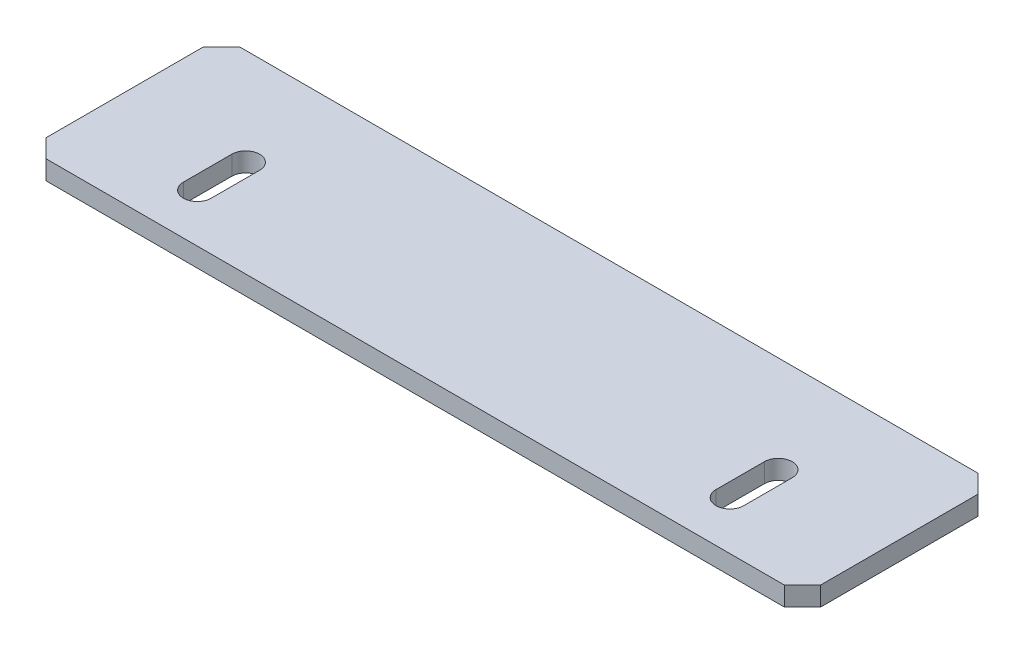
ISO-10303-21;
HEADER;
FILE_DESCRIPTION(('STEP AP214'),'2;1');
FILE_NAME('part.step','',(''),(''),'','','');
FILE_SCHEMA(('AUTOMOTIVE_DESIGN { 1 0 10303 214 1 1 1 1 }'));
ENDSEC;
DATA;
#1=APPLICATION_CONTEXT('core data for automotive mechanical design processes');
#2=APPLICATION_PROTOCOL_DEFINITION('international standard','automotive_design',2000,#1);
#3=PRODUCT_CONTEXT('',#1,'mechanical');
#4=PRODUCT('Part','Part','',(#3));
#5=PRODUCT_RELATED_PRODUCT_CATEGORY('part','',(#4));
#6=PRODUCT_DEFINITION_FORMATION('','',#4);
#7=PRODUCT_DEFINITION_CONTEXT('part definition',#1,'design');
#8=PRODUCT_DEFINITION('design','',#6,#7);
#9=PRODUCT_DEFINITION_SHAPE('','',#8);
#10=(LENGTH_UNIT() NAMED_UNIT(*) SI_UNIT(.MILLI.,.METRE.));
#11=(NAMED_UNIT(*) PLANE_ANGLE_UNIT() SI_UNIT($,.RADIAN.));
#12=(NAMED_UNIT(*) SI_UNIT($,.STERADIAN.) SOLID_ANGLE_UNIT());
#13=UNCERTAINTY_MEASURE_WITH_UNIT(LENGTH_MEASURE(1.E-05),#10,'distance_accuracy_value','');
#14=(GEOMETRIC_REPRESENTATION_CONTEXT(3) GLOBAL_UNCERTAINTY_ASSIGNED_CONTEXT((#13)) GLOBAL_UNIT_ASSIGNED_CONTEXT((#10,
#11,#12)) REPRESENTATION_CONTEXT('',''));
#15=CARTESIAN_POINT('',(0.,0.,0.));
#16=DIRECTION('',(0.,0.,1.));
#17=DIRECTION('',(1.,0.,0.));
#18=AXIS2_PLACEMENT_3D('',#15,#16,#17);
#19=CARTESIAN_POINT('',(0.,7.9,0.));
#20=DIRECTION('',(0.,-1.,0.));
#21=DIRECTION('',(0.,0.,-1.));
#22=AXIS2_PLACEMENT_3D('',#19,#20,#21);
#23=PLANE('',#22);
#24=CARTESIAN_POINT('',(220.,7.9,40.));
#25=DIRECTION('',(0.,1.,0.));
#26=DIRECTION('',(0.,0.,1.));
#27=AXIS2_PLACEMENT_3D('',#24,#25,#26);
#28=CIRCLE('',#27,11.5);
#29=CARTESIAN_POINT('',(208.5,7.9,40.));
#30=VERTEX_POINT('',#29);
#31=CARTESIAN_POINT('',(231.5,7.9,40.));
#32=VERTEX_POINT('',#31);
#33=EDGE_CURVE('E186',#30,#32,#28,.T.);
#34=ORIENTED_EDGE('',*,*,#33,.F.);
#35=DIRECTION('',(0.,0.,1.));
#36=VECTOR('',#35,1.);
#37=CARTESIAN_POINT('',(208.5,7.9,40.));
#38=LINE('',#37,#36);
#39=CARTESIAN_POINT('',(208.5,7.9,0.));
#40=VERTEX_POINT('',#39);
#41=EDGE_CURVE('E194',#40,#30,#38,.T.);
#42=ORIENTED_EDGE('',*,*,#41,.F.);
#43=CARTESIAN_POINT('',(220.,7.9,0.));
#44=DIRECTION('',(0.,1.,0.));
#45=DIRECTION('',(0.,0.,1.));
#46=AXIS2_PLACEMENT_3D('',#43,#44,#45);
#47=CIRCLE('',#46,11.5);
#48=CARTESIAN_POINT('',(231.5,7.9,0.));
#49=VERTEX_POINT('',#48);
#50=EDGE_CURVE('E191',#49,#40,#47,.T.);
#51=ORIENTED_EDGE('',*,*,#50,.F.);
#52=DIRECTION('',(0.,0.,-1.));
#53=VECTOR('',#52,1.);
#54=CARTESIAN_POINT('',(231.5,7.9,40.));
#55=LINE('',#54,#53);
#56=EDGE_CURVE('E188',#32,#49,#55,.T.);
#57=ORIENTED_EDGE('',*,*,#56,.F.);
#58=EDGE_LOOP('',(#34,#42,#51,#57));
#59=FACE_BOUND('',#58,.T.);
#60=DIRECTION('',(-1.,0.,0.));
#61=VECTOR('',#60,1.);
#62=CARTESIAN_POINT('',(-305.,7.9,-80.));
#63=LINE('',#62,#61);
#64=CARTESIAN_POINT('',(305.,7.9,-80.));
#65=VERTEX_POINT('',#64);
#66=CARTESIAN_POINT('',(-305.,7.9,-80.));
#67=VERTEX_POINT('',#66);
#68=EDGE_CURVE('E217',#65,#67,#63,.T.);
#69=ORIENTED_EDGE('',*,*,#68,.T.);
#70=DIRECTION('',(-0.707106781186548,0.,0.707106781186548));
#71=VECTOR('',#70,1.);
#72=CARTESIAN_POINT('',(-320.,7.9,-65.));
#73=LINE('',#72,#71);
#74=CARTESIAN_POINT('',(-320.,7.9,-65.));
#75=VERTEX_POINT('',#74);
#76=EDGE_CURVE('E220',#67,#75,#73,.T.);
#77=ORIENTED_EDGE('',*,*,#76,.T.);
#78=DIRECTION('',(0.,0.,1.));
#79=VECTOR('',#78,1.);
#80=CARTESIAN_POINT('',(-320.,7.9,-65.));
#81=LINE('',#80,#79);
#82=CARTESIAN_POINT('',(-320.,7.9,64.9999999999999));
#83=VERTEX_POINT('',#82);
#84=EDGE_CURVE('E223',#75,#83,#81,.T.);
#85=ORIENTED_EDGE('',*,*,#84,.T.);
#86=DIRECTION('',(0.707106781186546,0.,0.707106781186549));
#87=VECTOR('',#86,1.);
#88=CARTESIAN_POINT('',(-320.,7.9,64.9999999999999));
#89=LINE('',#88,#87);
#90=CARTESIAN_POINT('',(-305.,7.9,80.));
#91=VERTEX_POINT('',#90);
#92=EDGE_CURVE('E225',#83,#91,#89,.T.);
#93=ORIENTED_EDGE('',*,*,#92,.T.);
#94=DIRECTION('',(1.,0.,0.));
#95=VECTOR('',#94,1.);
#96=CARTESIAN_POINT('',(-305.,7.9,80.));
#97=LINE('',#96,#95);
#98=CARTESIAN_POINT('',(305.,7.9,80.));
#99=VERTEX_POINT('',#98);
#100=EDGE_CURVE('E227',#91,#99,#97,.T.);
#101=ORIENTED_EDGE('',*,*,#100,.T.);
#102=DIRECTION('',(0.707106781186548,0.,-0.707106781186548));
#103=VECTOR('',#102,1.);
#104=CARTESIAN_POINT('',(305.,7.9,80.));
#105=LINE('',#104,#103);
#106=CARTESIAN_POINT('',(320.,7.9,65.));
#107=VERTEX_POINT('',#106);
#108=EDGE_CURVE('E229',#99,#107,#105,.T.);
#109=ORIENTED_EDGE('',*,*,#108,.T.);
#110=DIRECTION('',(0.,0.,-1.));
#111=VECTOR('',#110,1.);
#112=CARTESIAN_POINT('',(320.,7.9,-65.0000000000001));
#113=LINE('',#112,#111);
#114=CARTESIAN_POINT('',(320.,7.9,-65.0000000000001));
#115=VERTEX_POINT('',#114);
#116=EDGE_CURVE('E231',#107,#115,#113,.T.);
#117=ORIENTED_EDGE('',*,*,#116,.T.);
#118=DIRECTION('',(-0.707106781186548,0.,-0.707106781186547));
#119=VECTOR('',#118,1.);
#120=CARTESIAN_POINT('',(305.,7.9,-80.));
#121=LINE('',#120,#119);
#122=EDGE_CURVE('E233',#115,#65,#121,.T.);
#123=ORIENTED_EDGE('',*,*,#122,.T.);
#124=EDGE_LOOP('',(#69,#77,#85,#93,#101,#109,#117,#123));
#125=FACE_BOUND('',#124,.T.);
#126=CARTESIAN_POINT('',(-220.,7.9,40.));
#127=DIRECTION('',(0.,1.,0.));
#128=DIRECTION('',(0.,0.,-1.));
#129=AXIS2_PLACEMENT_3D('',#126,#127,#128);
#130=CIRCLE('',#129,11.5);
#131=CARTESIAN_POINT('',(-231.5,7.9,40.));
#132=VERTEX_POINT('',#131);
#133=CARTESIAN_POINT('',(-208.5,7.9,40.));
#134=VERTEX_POINT('',#133);
#135=EDGE_CURVE('E150',#132,#134,#130,.T.);
#136=ORIENTED_EDGE('',*,*,#135,.F.);
#137=DIRECTION('',(0.,0.,1.));
#138=VECTOR('',#137,1.);
#139=CARTESIAN_POINT('',(-231.5,7.9,40.));
#140=LINE('',#139,#138);
#141=CARTESIAN_POINT('',(-231.5,7.9,0.));
#142=VERTEX_POINT('',#141);
#143=EDGE_CURVE('E172',#142,#132,#140,.T.);
#144=ORIENTED_EDGE('',*,*,#143,.F.);
#145=CARTESIAN_POINT('',(-220.,7.9,0.));
#146=DIRECTION('',(0.,1.,0.));
#147=DIRECTION('',(0.,0.,-1.));
#148=AXIS2_PLACEMENT_3D('',#145,#146,#147);
#149=CIRCLE('',#148,11.5);
#150=CARTESIAN_POINT('',(-208.5,7.9,0.));
#151=VERTEX_POINT('',#150);
#152=EDGE_CURVE('E170',#151,#142,#149,.T.);
#153=ORIENTED_EDGE('',*,*,#152,.F.);
#154=DIRECTION('',(0.,0.,-1.));
#155=VECTOR('',#154,1.);
#156=CARTESIAN_POINT('',(-208.5,7.9,40.));
#157=LINE('',#156,#155);
#158=EDGE_CURVE('E158',#134,#151,#157,.T.);
#159=ORIENTED_EDGE('',*,*,#158,.F.);
#160=EDGE_LOOP('',(#136,#144,#153,#159));
#161=FACE_BOUND('',#160,.T.);
#162=ADVANCED_FACE('F37',(#59,#125,#161),#23,.F.);
#163=CARTESIAN_POINT('',(0.,-7.9,0.));
#164=DIRECTION('',(0.,-1.,0.));
#165=DIRECTION('',(0.,0.,-1.));
#166=AXIS2_PLACEMENT_3D('',#163,#164,#165);
#167=PLANE('',#166);
#168=DIRECTION('',(-1.,0.,0.));
#169=VECTOR('',#168,1.);
#170=CARTESIAN_POINT('',(-305.,-7.9,-80.));
#171=LINE('',#170,#169);
#172=CARTESIAN_POINT('',(305.,-7.9,-80.));
#173=VERTEX_POINT('',#172);
#174=CARTESIAN_POINT('',(-305.,-7.9,-80.));
#175=VERTEX_POINT('',#174);
#176=EDGE_CURVE('E216',#173,#175,#171,.T.);
#177=ORIENTED_EDGE('',*,*,#176,.F.);
#178=DIRECTION('',(-0.707106781186548,0.,-0.707106781186547));
#179=VECTOR('',#178,1.);
#180=CARTESIAN_POINT('',(305.,-7.9,-80.));
#181=LINE('',#180,#179);
#182=CARTESIAN_POINT('',(320.,-7.9,-65.0000000000001));
#183=VERTEX_POINT('',#182);
#184=EDGE_CURVE('E221',#183,#173,#181,.T.);
#185=ORIENTED_EDGE('',*,*,#184,.F.);
#186=DIRECTION('',(0.,0.,-1.));
#187=VECTOR('',#186,1.);
#188=CARTESIAN_POINT('',(320.,-7.9,-65.0000000000001));
#189=LINE('',#188,#187);
#190=CARTESIAN_POINT('',(320.,-7.9,65.));
#191=VERTEX_POINT('',#190);
#192=EDGE_CURVE('E248',#191,#183,#189,.T.);
#193=ORIENTED_EDGE('',*,*,#192,.F.);
#194=DIRECTION('',(0.707106781186548,0.,-0.707106781186548));
#195=VECTOR('',#194,1.);
#196=CARTESIAN_POINT('',(305.,-7.9,80.));
#197=LINE('',#196,#195);
#198=CARTESIAN_POINT('',(305.,-7.9,80.));
#199=VERTEX_POINT('',#198);
#200=EDGE_CURVE('E246',#199,#191,#197,.T.);
#201=ORIENTED_EDGE('',*,*,#200,.F.);
#202=DIRECTION('',(1.,0.,0.));
#203=VECTOR('',#202,1.);
#204=CARTESIAN_POINT('',(-305.,-7.9,80.));
#205=LINE('',#204,#203);
#206=CARTESIAN_POINT('',(-305.,-7.9,80.));
#207=VERTEX_POINT('',#206);
#208=EDGE_CURVE('E244',#207,#199,#205,.T.);
#209=ORIENTED_EDGE('',*,*,#208,.F.);
#210=DIRECTION('',(0.707106781186546,0.,0.707106781186549));
#211=VECTOR('',#210,1.);
#212=CARTESIAN_POINT('',(-320.,-7.9,64.9999999999999));
#213=LINE('',#212,#211);
#214=CARTESIAN_POINT('',(-320.,-7.9,64.9999999999999));
#215=VERTEX_POINT('',#214);
#216=EDGE_CURVE('E242',#215,#207,#213,.T.);
#217=ORIENTED_EDGE('',*,*,#216,.F.);
#218=DIRECTION('',(0.,0.,1.));
#219=VECTOR('',#218,1.);
#220=CARTESIAN_POINT('',(-320.,-7.9,-65.));
#221=LINE('',#220,#219);
#222=CARTESIAN_POINT('',(-320.,-7.9,-65.));
#223=VERTEX_POINT('',#222);
#224=EDGE_CURVE('E240',#223,#215,#221,.T.);
#225=ORIENTED_EDGE('',*,*,#224,.F.);
#226=DIRECTION('',(-0.707106781186548,0.,0.707106781186548));
#227=VECTOR('',#226,1.);
#228=CARTESIAN_POINT('',(-320.,-7.9,-65.));
#229=LINE('',#228,#227);
#230=EDGE_CURVE('E238',#175,#223,#229,.T.);
#231=ORIENTED_EDGE('',*,*,#230,.F.);
#232=EDGE_LOOP('',(#177,#185,#193,#201,#209,#217,#225,#231));
#233=FACE_BOUND('',#232,.T.);
#234=DIRECTION('',(0.,0.,1.));
#235=VECTOR('',#234,1.);
#236=CARTESIAN_POINT('',(208.5,-7.9,40.));
#237=LINE('',#236,#235);
#238=CARTESIAN_POINT('',(208.5,-7.9,0.));
#239=VERTEX_POINT('',#238);
#240=CARTESIAN_POINT('',(208.5,-7.9,40.));
#241=VERTEX_POINT('',#240);
#242=EDGE_CURVE('E189',#239,#241,#237,.T.);
#243=ORIENTED_EDGE('',*,*,#242,.T.);
#244=CARTESIAN_POINT('',(220.,-7.9,40.));
#245=DIRECTION('',(0.,1.,0.));
#246=DIRECTION('',(0.,0.,1.));
#247=AXIS2_PLACEMENT_3D('',#244,#245,#246);
#248=CIRCLE('',#247,11.5);
#249=CARTESIAN_POINT('',(231.5,-7.9,40.));
#250=VERTEX_POINT('',#249);
#251=EDGE_CURVE('E166',#241,#250,#248,.T.);
#252=ORIENTED_EDGE('',*,*,#251,.T.);
#253=DIRECTION('',(0.,0.,-1.));
#254=VECTOR('',#253,1.);
#255=CARTESIAN_POINT('',(231.5,-7.9,40.));
#256=LINE('',#255,#254);
#257=CARTESIAN_POINT('',(231.5,-7.9,0.));
#258=VERTEX_POINT('',#257);
#259=EDGE_CURVE('E199',#250,#258,#256,.T.);
#260=ORIENTED_EDGE('',*,*,#259,.T.);
#261=CARTESIAN_POINT('',(220.,-7.9,0.));
#262=DIRECTION('',(0.,1.,0.));
#263=DIRECTION('',(0.,0.,1.));
#264=AXIS2_PLACEMENT_3D('',#261,#262,#263);
#265=CIRCLE('',#264,11.5);
#266=EDGE_CURVE('E202',#258,#239,#265,.T.);
#267=ORIENTED_EDGE('',*,*,#266,.T.);
#268=EDGE_LOOP('',(#243,#252,#260,#267));
#269=FACE_BOUND('',#268,.T.);
#270=DIRECTION('',(0.,0.,1.));
#271=VECTOR('',#270,1.);
#272=CARTESIAN_POINT('',(-231.5,-7.9,40.));
#273=LINE('',#272,#271);
#274=CARTESIAN_POINT('',(-231.5,-7.9,0.));
#275=VERTEX_POINT('',#274);
#276=CARTESIAN_POINT('',(-231.5,-7.9,40.));
#277=VERTEX_POINT('',#276);
#278=EDGE_CURVE('E159',#275,#277,#273,.T.);
#279=ORIENTED_EDGE('',*,*,#278,.T.);
#280=CARTESIAN_POINT('',(-220.,-7.9,40.));
#281=DIRECTION('',(0.,1.,0.));
#282=DIRECTION('',(0.,0.,-1.));
#283=AXIS2_PLACEMENT_3D('',#280,#281,#282);
#284=CIRCLE('',#283,11.5);
#285=CARTESIAN_POINT('',(-208.5,-7.9,40.));
#286=VERTEX_POINT('',#285);
#287=EDGE_CURVE('E60',#277,#286,#284,.T.);
#288=ORIENTED_EDGE('',*,*,#287,.T.);
#289=DIRECTION('',(0.,0.,-1.));
#290=VECTOR('',#289,1.);
#291=CARTESIAN_POINT('',(-208.5,-7.9,40.));
#292=LINE('',#291,#290);
#293=CARTESIAN_POINT('',(-208.5,-7.9,0.));
#294=VERTEX_POINT('',#293);
#295=EDGE_CURVE('E165',#286,#294,#292,.T.);
#296=ORIENTED_EDGE('',*,*,#295,.T.);
#297=CARTESIAN_POINT('',(-220.,-7.9,0.));
#298=DIRECTION('',(0.,1.,0.));
#299=DIRECTION('',(0.,0.,-1.));
#300=AXIS2_PLACEMENT_3D('',#297,#298,#299);
#301=CIRCLE('',#300,11.5);
#302=EDGE_CURVE('E178',#294,#275,#301,.T.);
#303=ORIENTED_EDGE('',*,*,#302,.T.);
#304=EDGE_LOOP('',(#279,#288,#296,#303));
#305=FACE_BOUND('',#304,.T.);
#306=ADVANCED_FACE('F278',(#233,#269,#305),#167,.T.);
#307=CARTESIAN_POINT('',(-305.,7.9,-80.));
#308=DIRECTION('',(0.,0.,1.));
#309=DIRECTION('',(1.,0.,0.));
#310=AXIS2_PLACEMENT_3D('',#307,#308,#309);
#311=PLANE('',#310);
#312=ORIENTED_EDGE('',*,*,#176,.T.);
#313=DIRECTION('',(0.,-1.,0.));
#314=VECTOR('',#313,1.);
#315=CARTESIAN_POINT('',(-305.,7.9,-80.));
#316=LINE('',#315,#314);
#317=EDGE_CURVE('E11',#67,#175,#316,.T.);
#318=ORIENTED_EDGE('',*,*,#317,.F.);
#319=ORIENTED_EDGE('',*,*,#68,.F.);
#320=DIRECTION('',(0.,-1.,0.));
#321=VECTOR('',#320,1.);
#322=CARTESIAN_POINT('',(305.,7.9,-80.));
#323=LINE('',#322,#321);
#324=EDGE_CURVE('E235',#65,#173,#323,.T.);
#325=ORIENTED_EDGE('',*,*,#324,.T.);
#326=EDGE_LOOP('',(#312,#318,#319,#325));
#327=FACE_BOUND('',#326,.T.);
#328=ADVANCED_FACE('F39',(#327),#311,.F.);
#329=CARTESIAN_POINT('',(-320.,7.9,-65.));
#330=DIRECTION('',(0.707106781186548,0.,0.707106781186548));
#331=DIRECTION('',(0.707106781186548,0.,-0.707106781186548));
#332=AXIS2_PLACEMENT_3D('',#329,#330,#331);
#333=PLANE('',#332);
#334=ORIENTED_EDGE('',*,*,#230,.T.);
#335=DIRECTION('',(0.,-1.,0.));
#336=VECTOR('',#335,1.);
#337=CARTESIAN_POINT('',(-320.,7.9,-65.));
#338=LINE('',#337,#336);
#339=EDGE_CURVE('E45',#75,#223,#338,.T.);
#340=ORIENTED_EDGE('',*,*,#339,.F.);
#341=ORIENTED_EDGE('',*,*,#76,.F.);
#342=ORIENTED_EDGE('',*,*,#317,.T.);
#343=EDGE_LOOP('',(#334,#340,#341,#342));
#344=FACE_BOUND('',#343,.T.);
#345=ADVANCED_FACE('F295',(#344),#333,.F.);
#346=CARTESIAN_POINT('',(-320.,7.9,-65.));
#347=DIRECTION('',(1.,0.,0.));
#348=DIRECTION('',(0.,0.,-1.));
#349=AXIS2_PLACEMENT_3D('',#346,#347,#348);
#350=PLANE('',#349);
#351=ORIENTED_EDGE('',*,*,#224,.T.);
#352=DIRECTION('',(0.,-1.,0.));
#353=VECTOR('',#352,1.);
#354=CARTESIAN_POINT('',(-320.,7.9,64.9999999999999));
#355=LINE('',#354,#353);
#356=EDGE_CURVE('E265',#83,#215,#355,.T.);
#357=ORIENTED_EDGE('',*,*,#356,.F.);
#358=ORIENTED_EDGE('',*,*,#84,.F.);
#359=ORIENTED_EDGE('',*,*,#339,.T.);
#360=EDGE_LOOP('',(#351,#357,#358,#359));
#361=FACE_BOUND('',#360,.T.);
#362=ADVANCED_FACE('F272',(#361),#350,.F.);
#363=CARTESIAN_POINT('',(-320.,7.9,64.9999999999999));
#364=DIRECTION('',(0.707106781186549,0.,-0.707106781186546));
#365=DIRECTION('',(-0.707106781186546,0.,-0.707106781186549));
#366=AXIS2_PLACEMENT_3D('',#363,#364,#365);
#367=PLANE('',#366);
#368=ORIENTED_EDGE('',*,*,#216,.T.);
#369=DIRECTION('',(0.,-1.,0.));
#370=VECTOR('',#369,1.);
#371=CARTESIAN_POINT('',(-305.,7.9,80.));
#372=LINE('',#371,#370);
#373=EDGE_CURVE('E262',#91,#207,#372,.T.);
#374=ORIENTED_EDGE('',*,*,#373,.F.);
#375=ORIENTED_EDGE('',*,*,#92,.F.);
#376=ORIENTED_EDGE('',*,*,#356,.T.);
#377=EDGE_LOOP('',(#368,#374,#375,#376));
#378=FACE_BOUND('',#377,.T.);
#379=ADVANCED_FACE('F284',(#378),#367,.F.);
#380=CARTESIAN_POINT('',(-305.,7.9,80.));
#381=DIRECTION('',(0.,0.,-1.));
#382=DIRECTION('',(-1.,0.,0.));
#383=AXIS2_PLACEMENT_3D('',#380,#381,#382);
#384=PLANE('',#383);
#385=ORIENTED_EDGE('',*,*,#208,.T.);
#386=DIRECTION('',(0.,-1.,0.));
#387=VECTOR('',#386,1.);
#388=CARTESIAN_POINT('',(305.,7.9,80.));
#389=LINE('',#388,#387);
#390=EDGE_CURVE('E259',#99,#199,#389,.T.);
#391=ORIENTED_EDGE('',*,*,#390,.F.);
#392=ORIENTED_EDGE('',*,*,#100,.F.);
#393=ORIENTED_EDGE('',*,*,#373,.T.);
#394=EDGE_LOOP('',(#385,#391,#392,#393));
#395=FACE_BOUND('',#394,.T.);
#396=ADVANCED_FACE('F288',(#395),#384,.F.);
#397=CARTESIAN_POINT('',(305.,7.9,80.));
#398=DIRECTION('',(-0.707106781186548,0.,-0.707106781186548));
#399=DIRECTION('',(-0.707106781186548,0.,0.707106781186548));
#400=AXIS2_PLACEMENT_3D('',#397,#398,#399);
#401=PLANE('',#400);
#402=ORIENTED_EDGE('',*,*,#200,.T.);
#403=DIRECTION('',(0.,-1.,0.));
#404=VECTOR('',#403,1.);
#405=CARTESIAN_POINT('',(320.,7.9,65.));
#406=LINE('',#405,#404);
#407=EDGE_CURVE('E256',#107,#191,#406,.T.);
#408=ORIENTED_EDGE('',*,*,#407,.F.);
#409=ORIENTED_EDGE('',*,*,#108,.F.);
#410=ORIENTED_EDGE('',*,*,#390,.T.);
#411=EDGE_LOOP('',(#402,#408,#409,#410));
#412=FACE_BOUND('',#411,.T.);
#413=ADVANCED_FACE('F308',(#412),#401,.F.);
#414=CARTESIAN_POINT('',(320.,7.9,-65.0000000000001));
#415=DIRECTION('',(-1.,0.,0.));
#416=DIRECTION('',(0.,0.,1.));
#417=AXIS2_PLACEMENT_3D('',#414,#415,#416);
#418=PLANE('',#417);
#419=ORIENTED_EDGE('',*,*,#192,.T.);
#420=DIRECTION('',(0.,-1.,0.));
#421=VECTOR('',#420,1.);
#422=CARTESIAN_POINT('',(320.,7.9,-65.0000000000001));
#423=LINE('',#422,#421);
#424=EDGE_CURVE('E253',#115,#183,#423,.T.);
#425=ORIENTED_EDGE('',*,*,#424,.F.);
#426=ORIENTED_EDGE('',*,*,#116,.F.);
#427=ORIENTED_EDGE('',*,*,#407,.T.);
#428=EDGE_LOOP('',(#419,#425,#426,#427));
#429=FACE_BOUND('',#428,.T.);
#430=ADVANCED_FACE('F306',(#429),#418,.F.);
#431=CARTESIAN_POINT('',(305.,7.9,-80.));
#432=DIRECTION('',(-0.707106781186547,0.,0.707106781186548));
#433=DIRECTION('',(0.707106781186548,0.,0.707106781186547));
#434=AXIS2_PLACEMENT_3D('',#431,#432,#433);
#435=PLANE('',#434);
#436=ORIENTED_EDGE('',*,*,#184,.T.);
#437=ORIENTED_EDGE('',*,*,#324,.F.);
#438=ORIENTED_EDGE('',*,*,#122,.F.);
#439=ORIENTED_EDGE('',*,*,#424,.T.);
#440=EDGE_LOOP('',(#436,#437,#438,#439));
#441=FACE_BOUND('',#440,.T.);
#442=ADVANCED_FACE('F301',(#441),#435,.F.);
#443=CARTESIAN_POINT('',(220.,7.9,40.));
#444=DIRECTION('',(0.,-1.,0.));
#445=DIRECTION('',(0.,0.,-1.));
#446=AXIS2_PLACEMENT_3D('',#443,#444,#445);
#447=CYLINDRICAL_SURFACE('',#446,11.5);
#448=ORIENTED_EDGE('',*,*,#251,.F.);
#449=DIRECTION('',(0.,-1.,0.));
#450=VECTOR('',#449,1.);
#451=CARTESIAN_POINT('',(208.5,7.9,40.));
#452=LINE('',#451,#450);
#453=EDGE_CURVE('E196',#30,#241,#452,.T.);
#454=ORIENTED_EDGE('',*,*,#453,.F.);
#455=ORIENTED_EDGE('',*,*,#33,.T.);
#456=DIRECTION('',(0.,-1.,0.));
#457=VECTOR('',#456,1.);
#458=CARTESIAN_POINT('',(231.5,7.9,40.));
#459=LINE('',#458,#457);
#460=EDGE_CURVE('E213',#32,#250,#459,.T.);
#461=ORIENTED_EDGE('',*,*,#460,.T.);
#462=EDGE_LOOP('',(#448,#454,#455,#461));
#463=FACE_BOUND('',#462,.T.);
#464=ADVANCED_FACE('F326',(#463),#447,.F.);
#465=CARTESIAN_POINT('',(231.5,7.9,40.));
#466=DIRECTION('',(-1.,0.,0.));
#467=DIRECTION('',(0.,0.,1.));
#468=AXIS2_PLACEMENT_3D('',#465,#466,#467);
#469=PLANE('',#468);
#470=ORIENTED_EDGE('',*,*,#259,.F.);
#471=ORIENTED_EDGE('',*,*,#460,.F.);
#472=ORIENTED_EDGE('',*,*,#56,.T.);
#473=DIRECTION('',(0.,-1.,0.));
#474=VECTOR('',#473,1.);
#475=CARTESIAN_POINT('',(231.5,7.9,0.));
#476=LINE('',#475,#474);
#477=EDGE_CURVE('E211',#49,#258,#476,.T.);
#478=ORIENTED_EDGE('',*,*,#477,.T.);
#479=EDGE_LOOP('',(#470,#471,#472,#478));
#480=FACE_BOUND('',#479,.T.);
#481=ADVANCED_FACE('F333',(#480),#469,.T.);
#482=CARTESIAN_POINT('',(220.,7.9,0.));
#483=DIRECTION('',(0.,-1.,0.));
#484=DIRECTION('',(0.,0.,-1.));
#485=AXIS2_PLACEMENT_3D('',#482,#483,#484);
#486=CYLINDRICAL_SURFACE('',#485,11.5);
#487=ORIENTED_EDGE('',*,*,#266,.F.);
#488=ORIENTED_EDGE('',*,*,#477,.F.);
#489=ORIENTED_EDGE('',*,*,#50,.T.);
#490=DIRECTION('',(0.,-1.,0.));
#491=VECTOR('',#490,1.);
#492=CARTESIAN_POINT('',(208.5,7.9,0.));
#493=LINE('',#492,#491);
#494=EDGE_CURVE('E209',#40,#239,#493,.T.);
#495=ORIENTED_EDGE('',*,*,#494,.T.);
#496=EDGE_LOOP('',(#487,#488,#489,#495));
#497=FACE_BOUND('',#496,.T.);
#498=ADVANCED_FACE('F338',(#497),#486,.F.);
#499=CARTESIAN_POINT('',(208.5,7.9,40.));
#500=DIRECTION('',(1.,0.,0.));
#501=DIRECTION('',(0.,0.,-1.));
#502=AXIS2_PLACEMENT_3D('',#499,#500,#501);
#503=PLANE('',#502);
#504=ORIENTED_EDGE('',*,*,#242,.F.);
#505=ORIENTED_EDGE('',*,*,#494,.F.);
#506=ORIENTED_EDGE('',*,*,#41,.T.);
#507=ORIENTED_EDGE('',*,*,#453,.T.);
#508=EDGE_LOOP('',(#504,#505,#506,#507));
#509=FACE_BOUND('',#508,.T.);
#510=ADVANCED_FACE('F344',(#509),#503,.T.);
#511=CARTESIAN_POINT('',(-220.,7.9,40.));
#512=DIRECTION('',(0.,-1.,0.));
#513=DIRECTION('',(0.,0.,-1.));
#514=AXIS2_PLACEMENT_3D('',#511,#512,#513);
#515=CYLINDRICAL_SURFACE('',#514,11.5);
#516=ORIENTED_EDGE('',*,*,#287,.F.);
#517=DIRECTION('',(0.,-1.,0.));
#518=VECTOR('',#517,1.);
#519=CARTESIAN_POINT('',(-231.5,7.9,40.));
#520=LINE('',#519,#518);
#521=EDGE_CURVE('E154',#132,#277,#520,.T.);
#522=ORIENTED_EDGE('',*,*,#521,.F.);
#523=ORIENTED_EDGE('',*,*,#135,.T.);
#524=DIRECTION('',(0.,-1.,0.));
#525=VECTOR('',#524,1.);
#526=CARTESIAN_POINT('',(-208.5,7.9,40.));
#527=LINE('',#526,#525);
#528=EDGE_CURVE('E153',#134,#286,#527,.T.);
#529=ORIENTED_EDGE('',*,*,#528,.T.);
#530=EDGE_LOOP('',(#516,#522,#523,#529));
#531=FACE_BOUND('',#530,.T.);
#532=ADVANCED_FACE('F152',(#531),#515,.F.);
#533=CARTESIAN_POINT('',(-208.5,7.9,40.));
#534=DIRECTION('',(-1.,0.,0.));
#535=DIRECTION('',(0.,0.,1.));
#536=AXIS2_PLACEMENT_3D('',#533,#534,#535);
#537=PLANE('',#536);
#538=ORIENTED_EDGE('',*,*,#295,.F.);
#539=ORIENTED_EDGE('',*,*,#528,.F.);
#540=ORIENTED_EDGE('',*,*,#158,.T.);
#541=DIRECTION('',(0.,-1.,0.));
#542=VECTOR('',#541,1.);
#543=CARTESIAN_POINT('',(-208.5,7.9,0.));
#544=LINE('',#543,#542);
#545=EDGE_CURVE('E167',#151,#294,#544,.T.);
#546=ORIENTED_EDGE('',*,*,#545,.T.);
#547=EDGE_LOOP('',(#538,#539,#540,#546));
#548=FACE_BOUND('',#547,.T.);
#549=ADVANCED_FACE('F162',(#548),#537,.T.);
#550=CARTESIAN_POINT('',(-220.,7.9,0.));
#551=DIRECTION('',(0.,-1.,0.));
#552=DIRECTION('',(0.,0.,-1.));
#553=AXIS2_PLACEMENT_3D('',#550,#551,#552);
#554=CYLINDRICAL_SURFACE('',#553,11.5);
#555=ORIENTED_EDGE('',*,*,#302,.F.);
#556=ORIENTED_EDGE('',*,*,#545,.F.);
#557=ORIENTED_EDGE('',*,*,#152,.T.);
#558=DIRECTION('',(0.,-1.,0.));
#559=VECTOR('',#558,1.);
#560=CARTESIAN_POINT('',(-231.5,7.9,0.));
#561=LINE('',#560,#559);
#562=EDGE_CURVE('E52',#142,#275,#561,.T.);
#563=ORIENTED_EDGE('',*,*,#562,.T.);
#564=EDGE_LOOP('',(#555,#556,#557,#563));
#565=FACE_BOUND('',#564,.T.);
#566=ADVANCED_FACE('F363',(#565),#554,.F.);
#567=CARTESIAN_POINT('',(-231.5,7.9,40.));
#568=DIRECTION('',(1.,0.,0.));
#569=DIRECTION('',(0.,0.,-1.));
#570=AXIS2_PLACEMENT_3D('',#567,#568,#569);
#571=PLANE('',#570);
#572=ORIENTED_EDGE('',*,*,#278,.F.);
#573=ORIENTED_EDGE('',*,*,#562,.F.);
#574=ORIENTED_EDGE('',*,*,#143,.T.);
#575=ORIENTED_EDGE('',*,*,#521,.T.);
#576=EDGE_LOOP('',(#572,#573,#574,#575));
#577=FACE_BOUND('',#576,.T.);
#578=ADVANCED_FACE('F366',(#577),#571,.T.);
#579=CLOSED_SHELL('',(#162,#306,#328,#345,#362,#379,#396,#413,#430,#442,#464,#481,#498,#510,
#532,#549,#566,#578));
#580=MANIFOLD_SOLID_BREP('B2',#579);
#581=ADVANCED_BREP_SHAPE_REPRESENTATION('',(#18,#580),#14);
#582=SHAPE_DEFINITION_REPRESENTATION(#9,#581);
ENDSEC;
END-ISO-10303-21;
